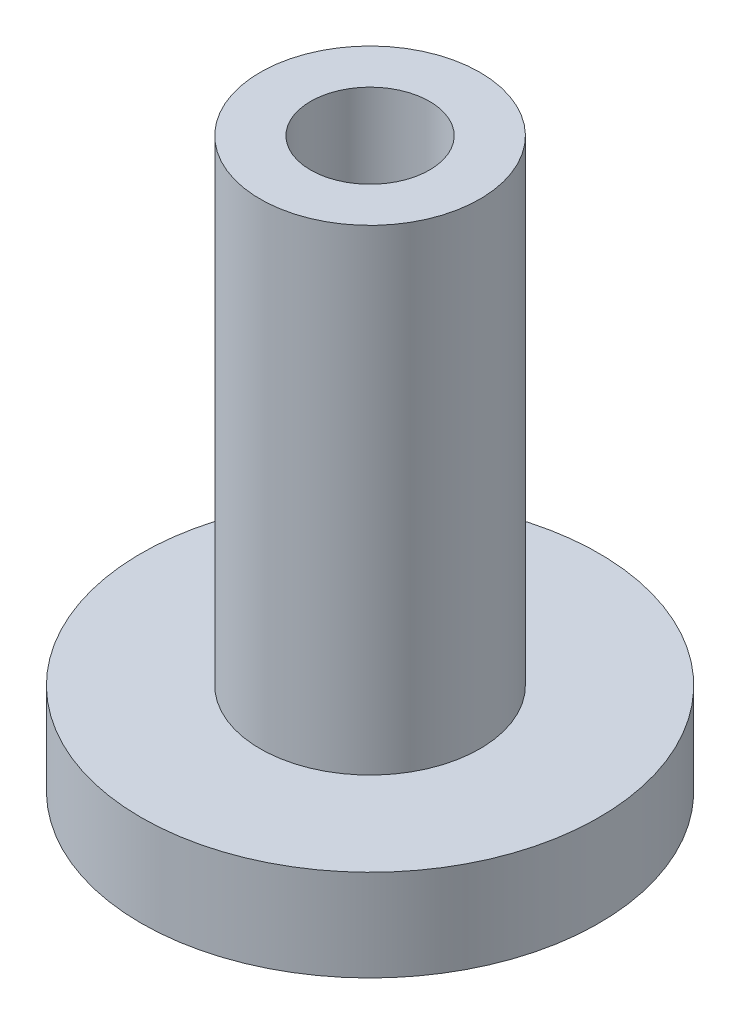
ISO-10303-21;
HEADER;
FILE_DESCRIPTION(('STEP AP214'),'2;1');
FILE_NAME('part.step','',(''),(''),'','','');
FILE_SCHEMA(('AUTOMOTIVE_DESIGN { 1 0 10303 214 1 1 1 1 }'));
ENDSEC;
DATA;
#1=APPLICATION_CONTEXT('core data for automotive mechanical design processes');
#2=APPLICATION_PROTOCOL_DEFINITION('international standard','automotive_design',2000,#1);
#3=PRODUCT_CONTEXT('',#1,'mechanical');
#4=PRODUCT('Part','Part','',(#3));
#5=PRODUCT_RELATED_PRODUCT_CATEGORY('part','',(#4));
#6=PRODUCT_DEFINITION_FORMATION('','',#4);
#7=PRODUCT_DEFINITION_CONTEXT('part definition',#1,'design');
#8=PRODUCT_DEFINITION('design','',#6,#7);
#9=PRODUCT_DEFINITION_SHAPE('','',#8);
#10=(LENGTH_UNIT() NAMED_UNIT(*) SI_UNIT(.MILLI.,.METRE.));
#11=(NAMED_UNIT(*) PLANE_ANGLE_UNIT() SI_UNIT($,.RADIAN.));
#12=(NAMED_UNIT(*) SI_UNIT($,.STERADIAN.) SOLID_ANGLE_UNIT());
#13=UNCERTAINTY_MEASURE_WITH_UNIT(LENGTH_MEASURE(1.E-05),#10,'distance_accuracy_value','');
#14=(GEOMETRIC_REPRESENTATION_CONTEXT(3) GLOBAL_UNCERTAINTY_ASSIGNED_CONTEXT((#13)) GLOBAL_UNIT_ASSIGNED_CONTEXT((#10,
#11,#12)) REPRESENTATION_CONTEXT('',''));
#15=CARTESIAN_POINT('',(0.,0.,0.));
#16=DIRECTION('',(0.,0.,1.));
#17=DIRECTION('',(1.,0.,0.));
#18=AXIS2_PLACEMENT_3D('',#15,#16,#17);
#19=CARTESIAN_POINT('',(0.,2.54,0.));
#20=DIRECTION('',(0.,-1.,0.));
#21=DIRECTION('',(0.,0.,-1.));
#22=AXIS2_PLACEMENT_3D('',#19,#20,#21);
#23=CYLINDRICAL_SURFACE('',#22,6.35);
#24=CARTESIAN_POINT('',(0.,2.54,0.));
#25=DIRECTION('',(0.,1.,0.));
#26=DIRECTION('',(0.,0.,1.));
#27=AXIS2_PLACEMENT_3D('',#24,#25,#26);
#28=CIRCLE('',#27,6.35);
#29=CARTESIAN_POINT('',(0.,2.54,6.35));
#30=VERTEX_POINT('',#29);
#31=EDGE_CURVE('E49',#30,#30,#28,.T.);
#32=ORIENTED_EDGE('',*,*,#31,.F.);
#33=EDGE_LOOP('',(#32));
#34=FACE_BOUND('',#33,.T.);
#35=CARTESIAN_POINT('',(0.,0.,0.));
#36=DIRECTION('',(0.,1.,0.));
#37=DIRECTION('',(0.,0.,1.));
#38=AXIS2_PLACEMENT_3D('',#35,#36,#37);
#39=CIRCLE('',#38,6.35);
#40=CARTESIAN_POINT('',(0.,0.,6.35));
#41=VERTEX_POINT('',#40);
#42=EDGE_CURVE('E44',#41,#41,#39,.T.);
#43=ORIENTED_EDGE('',*,*,#42,.T.);
#44=EDGE_LOOP('',(#43));
#45=FACE_BOUND('',#44,.T.);
#46=ADVANCED_FACE('F41',(#34,#45),#23,.T.);
#47=CARTESIAN_POINT('',(0.,2.54,0.));
#48=DIRECTION('',(0.,1.,0.));
#49=DIRECTION('',(0.,0.,1.));
#50=AXIS2_PLACEMENT_3D('',#47,#48,#49);
#51=PLANE('',#50);
#52=CARTESIAN_POINT('',(0.,2.54,0.));
#53=DIRECTION('',(0.,1.,0.));
#54=DIRECTION('',(0.,0.,1.));
#55=AXIS2_PLACEMENT_3D('',#52,#53,#54);
#56=CIRCLE('',#55,3.048);
#57=CARTESIAN_POINT('',(0.,2.54,-3.048));
#58=VERTEX_POINT('',#57);
#59=EDGE_CURVE('E10',#58,#58,#56,.T.);
#60=ORIENTED_EDGE('',*,*,#59,.F.);
#61=EDGE_LOOP('',(#60));
#62=FACE_BOUND('',#61,.T.);
#63=ORIENTED_EDGE('',*,*,#31,.T.);
#64=EDGE_LOOP('',(#63));
#65=FACE_BOUND('',#64,.T.);
#66=ADVANCED_FACE('F90',(#62,#65),#51,.T.);
#67=CARTESIAN_POINT('',(0.,0.,0.));
#68=DIRECTION('',(0.,1.,0.));
#69=DIRECTION('',(0.,0.,1.));
#70=AXIS2_PLACEMENT_3D('',#67,#68,#69);
#71=PLANE('',#70);
#72=CARTESIAN_POINT('',(0.,0.,0.));
#73=DIRECTION('',(0.,1.,0.));
#74=DIRECTION('',(0.,0.,1.));
#75=AXIS2_PLACEMENT_3D('',#72,#73,#74);
#76=CIRCLE('',#75,1.651);
#77=CARTESIAN_POINT('',(0.,0.,1.651));
#78=VERTEX_POINT('',#77);
#79=EDGE_CURVE('E60',#78,#78,#76,.T.);
#80=ORIENTED_EDGE('',*,*,#79,.T.);
#81=EDGE_LOOP('',(#80));
#82=FACE_BOUND('',#81,.T.);
#83=ORIENTED_EDGE('',*,*,#42,.F.);
#84=EDGE_LOOP('',(#83));
#85=FACE_BOUND('',#84,.T.);
#86=ADVANCED_FACE('F69',(#82,#85),#71,.F.);
#87=CARTESIAN_POINT('',(0.,15.748,0.));
#88=DIRECTION('',(0.,-1.,0.));
#89=DIRECTION('',(0.,0.,-1.));
#90=AXIS2_PLACEMENT_3D('',#87,#88,#89);
#91=CYLINDRICAL_SURFACE('',#90,3.048);
#92=CARTESIAN_POINT('',(0.,15.748,0.));
#93=DIRECTION('',(0.,1.,0.));
#94=DIRECTION('',(0.,0.,1.));
#95=AXIS2_PLACEMENT_3D('',#92,#93,#94);
#96=CIRCLE('',#95,3.048);
#97=CARTESIAN_POINT('',(0.,15.748,-3.048));
#98=VERTEX_POINT('',#97);
#99=EDGE_CURVE('E56',#98,#98,#96,.T.);
#100=CARTESIAN_POINT('',(0.,15.748,-3.048));
#101=CARTESIAN_POINT('',(0.,15.6104166666667,-3.048));
#102=CARTESIAN_POINT('',(0.,15.4728333333333,-3.048));
#103=CARTESIAN_POINT('',(0.,15.1976666666667,-3.048));
#104=CARTESIAN_POINT('',(0.,15.0600833333333,-3.048));
#105=CARTESIAN_POINT('',(0.,14.7849166666667,-3.048));
#106=CARTESIAN_POINT('',(0.,14.6473333333333,-3.048));
#107=CARTESIAN_POINT('',(0.,14.3721666666667,-3.048));
#108=CARTESIAN_POINT('',(0.,14.2345833333333,-3.048));
#109=CARTESIAN_POINT('',(0.,13.9594166666667,-3.048));
#110=CARTESIAN_POINT('',(0.,13.8218333333333,-3.048));
#111=CARTESIAN_POINT('',(0.,13.5466666666667,-3.048));
#112=CARTESIAN_POINT('',(0.,13.4090833333333,-3.048));
#113=CARTESIAN_POINT('',(0.,13.1339166666667,-3.048));
#114=CARTESIAN_POINT('',(0.,12.9963333333333,-3.048));
#115=CARTESIAN_POINT('',(0.,12.7211666666667,-3.048));
#116=CARTESIAN_POINT('',(0.,12.5835833333333,-3.048));
#117=CARTESIAN_POINT('',(0.,12.3084166666667,-3.048));
#118=CARTESIAN_POINT('',(0.,12.1708333333333,-3.048));
#119=CARTESIAN_POINT('',(0.,11.8956666666667,-3.048));
#120=CARTESIAN_POINT('',(0.,11.7580833333333,-3.048));
#121=CARTESIAN_POINT('',(0.,11.4829166666667,-3.048));
#122=CARTESIAN_POINT('',(0.,11.3453333333333,-3.048));
#123=CARTESIAN_POINT('',(0.,11.0701666666667,-3.048));
#124=CARTESIAN_POINT('',(0.,10.9325833333333,-3.048));
#125=CARTESIAN_POINT('',(0.,10.6574166666667,-3.048));
#126=CARTESIAN_POINT('',(0.,10.5198333333333,-3.048));
#127=CARTESIAN_POINT('',(0.,10.2446666666667,-3.048));
#128=CARTESIAN_POINT('',(0.,10.1070833333333,-3.048));
#129=CARTESIAN_POINT('',(0.,9.83191666666666,-3.048));
#130=CARTESIAN_POINT('',(0.,9.69433333333333,-3.048));
#131=CARTESIAN_POINT('',(0.,9.41916666666666,-3.048));
#132=CARTESIAN_POINT('',(0.,9.28158333333333,-3.048));
#133=CARTESIAN_POINT('',(0.,9.00641666666666,-3.048));
#134=CARTESIAN_POINT('',(0.,8.86883333333333,-3.048));
#135=CARTESIAN_POINT('',(0.,8.59366666666666,-3.048));
#136=CARTESIAN_POINT('',(0.,8.45608333333333,-3.048));
#137=CARTESIAN_POINT('',(0.,8.18091666666666,-3.048));
#138=CARTESIAN_POINT('',(0.,8.04333333333333,-3.048));
#139=CARTESIAN_POINT('',(0.,7.76816666666666,-3.048));
#140=CARTESIAN_POINT('',(0.,7.63058333333333,-3.048));
#141=CARTESIAN_POINT('',(0.,7.35541666666666,-3.048));
#142=CARTESIAN_POINT('',(0.,7.21783333333333,-3.048));
#143=CARTESIAN_POINT('',(0.,6.94266666666666,-3.048));
#144=CARTESIAN_POINT('',(0.,6.80508333333333,-3.048));
#145=CARTESIAN_POINT('',(0.,6.52991666666667,-3.048));
#146=CARTESIAN_POINT('',(0.,6.39233333333333,-3.048));
#147=CARTESIAN_POINT('',(0.,6.11716666666667,-3.048));
#148=CARTESIAN_POINT('',(0.,5.97958333333333,-3.048));
#149=CARTESIAN_POINT('',(0.,5.70441666666667,-3.048));
#150=CARTESIAN_POINT('',(0.,5.56683333333333,-3.048));
#151=CARTESIAN_POINT('',(0.,5.29166666666667,-3.048));
#152=CARTESIAN_POINT('',(0.,5.15408333333333,-3.048));
#153=CARTESIAN_POINT('',(0.,4.87891666666667,-3.048));
#154=CARTESIAN_POINT('',(0.,4.74133333333333,-3.048));
#155=CARTESIAN_POINT('',(0.,4.46616666666667,-3.048));
#156=CARTESIAN_POINT('',(0.,4.32858333333333,-3.048));
#157=CARTESIAN_POINT('',(0.,4.05341666666667,-3.048));
#158=CARTESIAN_POINT('',(0.,3.91583333333333,-3.048));
#159=CARTESIAN_POINT('',(0.,3.64066666666667,-3.048));
#160=CARTESIAN_POINT('',(0.,3.50308333333333,-3.048));
#161=CARTESIAN_POINT('',(0.,3.22791666666667,-3.048));
#162=CARTESIAN_POINT('',(0.,3.09033333333333,-3.048));
#163=CARTESIAN_POINT('',(0.,2.81516666666667,-3.048));
#164=CARTESIAN_POINT('',(0.,2.67758333333333,-3.048));
#165=CARTESIAN_POINT('',(0.,2.54,-3.048));
#166=B_SPLINE_CURVE_WITH_KNOTS('',3,(#100,#101,#102,#103,#104,#105,#106,#107,#108,#109,#110,
#111,#112,#113,#114,#115,#116,#117,#118,#119,#120,#121,#122,#123,#124,#125,#126,#127,#128,#129,
#130,#131,#132,#133,#134,#135,#136,#137,#138,#139,#140,#141,#142,#143,#144,#145,#146,#147,#148,
#149,#150,#151,#152,#153,#154,#155,#156,#157,#158,#159,#160,#161,#162,#163,#164,#165),
.UNSPECIFIED.,.F.,.F.,(4,2,2,2,2,2,2,2,2,2,2,2,2,2,2,2,2,2,2,2,2,2,2,2,2,2,2,2,2,2,2,2,4),(0.,
0.412750000000002,0.825500000000002,1.23825,1.651,2.06375,2.4765,2.88925,3.302,3.71475,4.1275,
4.54025,4.953,5.36575,5.7785,6.19125,6.604,7.01675,7.4295,7.84225,8.255,8.66775,9.0805,9.49325,
9.906,10.31875,10.7315,11.14425,11.557,11.96975,12.3825,12.79525,13.208),.UNSPECIFIED.);
#167=EDGE_CURVE('BSEAM81',#98,#58,#166,.T.);
#168=ORIENTED_EDGE('',*,*,#99,.F.);
#169=ORIENTED_EDGE('',*,*,#59,.T.);
#170=ORIENTED_EDGE('',*,*,#167,.T.);
#171=ORIENTED_EDGE('',*,*,#167,.F.);
#172=EDGE_LOOP('',(#168,#170,#169,#171));
#173=FACE_BOUND('',#172,.T.);
#174=ADVANCED_FACE('F81',(#173),#91,.T.);
#175=CARTESIAN_POINT('',(0.,15.748,0.));
#176=DIRECTION('',(0.,1.,0.));
#177=DIRECTION('',(0.,0.,1.));
#178=AXIS2_PLACEMENT_3D('',#175,#176,#177);
#179=PLANE('',#178);
#180=CARTESIAN_POINT('',(0.,15.748,0.));
#181=DIRECTION('',(0.,1.,0.));
#182=DIRECTION('',(0.,0.,1.));
#183=AXIS2_PLACEMENT_3D('',#180,#181,#182);
#184=CIRCLE('',#183,1.651);
#185=CARTESIAN_POINT('',(0.,15.748,1.651));
#186=VERTEX_POINT('',#185);
#187=EDGE_CURVE('E61',#186,#186,#184,.T.);
#188=ORIENTED_EDGE('',*,*,#187,.F.);
#189=EDGE_LOOP('',(#188));
#190=FACE_BOUND('',#189,.T.);
#191=ORIENTED_EDGE('',*,*,#99,.T.);
#192=EDGE_LOOP('',(#191));
#193=FACE_BOUND('',#192,.T.);
#194=ADVANCED_FACE('F75',(#190,#193),#179,.T.);
#195=CARTESIAN_POINT('',(0.,0.,0.));
#196=DIRECTION('',(0.,1.,0.));
#197=DIRECTION('',(0.,0.,1.));
#198=AXIS2_PLACEMENT_3D('',#195,#196,#197);
#199=CYLINDRICAL_SURFACE('',#198,1.651);
#200=ORIENTED_EDGE('',*,*,#79,.F.);
#201=EDGE_LOOP('',(#200));
#202=FACE_BOUND('',#201,.T.);
#203=ORIENTED_EDGE('',*,*,#187,.T.);
#204=EDGE_LOOP('',(#203));
#205=FACE_BOUND('',#204,.T.);
#206=ADVANCED_FACE('F72',(#202,#205),#199,.F.);
#207=CLOSED_SHELL('',(#46,#66,#86,#174,#194,#206));
#208=MANIFOLD_SOLID_BREP('B2',#207);
#209=ADVANCED_BREP_SHAPE_REPRESENTATION('',(#18,#208),#14);
#210=SHAPE_DEFINITION_REPRESENTATION(#9,#209);
ENDSEC;
END-ISO-10303-21;
